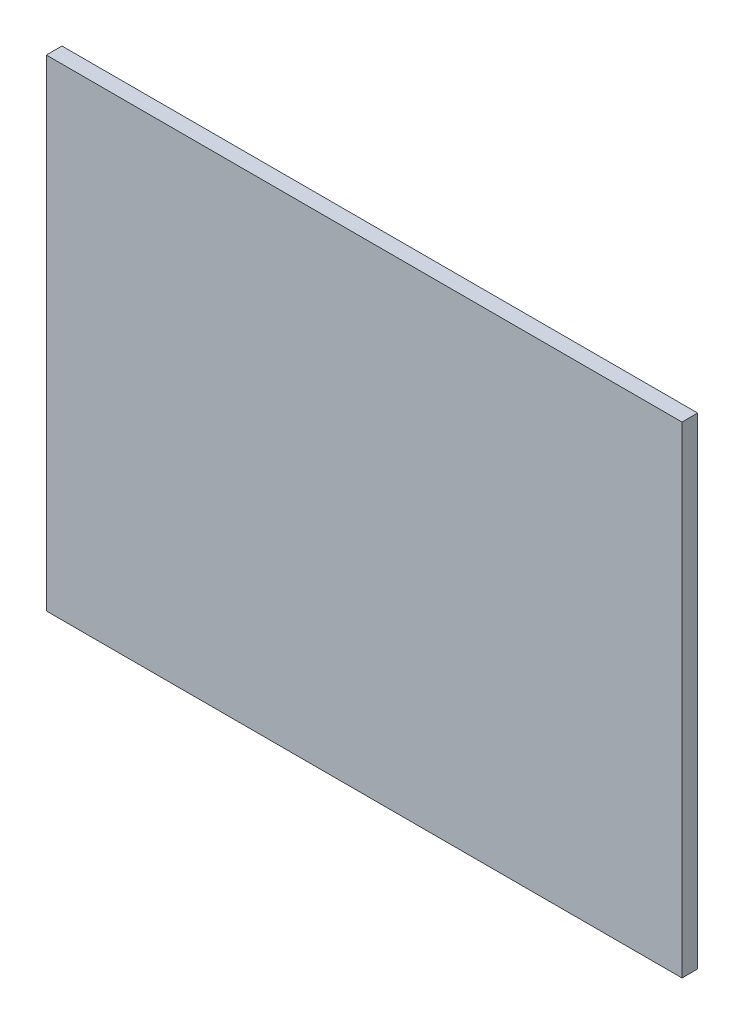
ISO-10303-21;
HEADER;
FILE_DESCRIPTION(('STEP AP214'),'2;1');
FILE_NAME('part.step','',(''),(''),'','','');
FILE_SCHEMA(('AUTOMOTIVE_DESIGN { 1 0 10303 214 1 1 1 1 }'));
ENDSEC;
DATA;
#1=APPLICATION_CONTEXT('core data for automotive mechanical design processes');
#2=APPLICATION_PROTOCOL_DEFINITION('international standard','automotive_design',2000,#1);
#3=PRODUCT_CONTEXT('',#1,'mechanical');
#4=PRODUCT('Part','Part','',(#3));
#5=PRODUCT_RELATED_PRODUCT_CATEGORY('part','',(#4));
#6=PRODUCT_DEFINITION_FORMATION('','',#4);
#7=PRODUCT_DEFINITION_CONTEXT('part definition',#1,'design');
#8=PRODUCT_DEFINITION('design','',#6,#7);
#9=PRODUCT_DEFINITION_SHAPE('','',#8);
#10=(LENGTH_UNIT() NAMED_UNIT(*) SI_UNIT(.MILLI.,.METRE.));
#11=(NAMED_UNIT(*) PLANE_ANGLE_UNIT() SI_UNIT($,.RADIAN.));
#12=(NAMED_UNIT(*) SI_UNIT($,.STERADIAN.) SOLID_ANGLE_UNIT());
#13=UNCERTAINTY_MEASURE_WITH_UNIT(LENGTH_MEASURE(1.E-05),#10,'distance_accuracy_value','');
#14=(GEOMETRIC_REPRESENTATION_CONTEXT(3) GLOBAL_UNCERTAINTY_ASSIGNED_CONTEXT((#13)) GLOBAL_UNIT_ASSIGNED_CONTEXT((#10,
#11,#12)) REPRESENTATION_CONTEXT('',''));
#15=CARTESIAN_POINT('',(0.,0.,0.));
#16=DIRECTION('',(0.,0.,1.));
#17=DIRECTION('',(1.,0.,0.));
#18=AXIS2_PLACEMENT_3D('',#15,#16,#17);
#19=CARTESIAN_POINT('',(206.368778379794,-412.72012546708,-10.16));
#20=DIRECTION('',(1.,0.,0.));
#21=DIRECTION('',(0.,0.,-1.));
#22=AXIS2_PLACEMENT_3D('',#19,#20,#21);
#23=PLANE('',#22);
#24=DIRECTION('',(0.,1.,0.));
#25=VECTOR('',#24,1.);
#26=CARTESIAN_POINT('',(206.368778379794,-412.72012546708,0.));
#27=LINE('',#26,#25);
#28=CARTESIAN_POINT('',(206.368778379794,-412.72012546708,0.));
#29=VERTEX_POINT('',#28);
#30=CARTESIAN_POINT('',(206.368778379794,-100.02012546708,0.));
#31=VERTEX_POINT('',#30);
#32=EDGE_CURVE('E101',#29,#31,#27,.T.);
#33=ORIENTED_EDGE('',*,*,#32,.F.);
#34=DIRECTION('',(0.,0.,1.));
#35=VECTOR('',#34,1.);
#36=CARTESIAN_POINT('',(206.368778379794,-412.72012546708,-10.16));
#37=LINE('',#36,#35);
#38=CARTESIAN_POINT('',(206.368778379794,-412.72012546708,-10.16));
#39=VERTEX_POINT('',#38);
#40=EDGE_CURVE('E11',#39,#29,#37,.T.);
#41=ORIENTED_EDGE('',*,*,#40,.F.);
#42=DIRECTION('',(0.,1.,0.));
#43=VECTOR('',#42,1.);
#44=CARTESIAN_POINT('',(206.368778379794,-412.72012546708,-10.16));
#45=LINE('',#44,#43);
#46=CARTESIAN_POINT('',(206.368778379794,-100.02012546708,-10.16));
#47=VERTEX_POINT('',#46);
#48=EDGE_CURVE('E95',#39,#47,#45,.T.);
#49=ORIENTED_EDGE('',*,*,#48,.T.);
#50=DIRECTION('',(0.,0.,1.));
#51=VECTOR('',#50,1.);
#52=CARTESIAN_POINT('',(206.368778379794,-100.02012546708,-10.16));
#53=LINE('',#52,#51);
#54=EDGE_CURVE('E40',#47,#31,#53,.T.);
#55=ORIENTED_EDGE('',*,*,#54,.T.);
#56=EDGE_LOOP('',(#33,#41,#49,#55));
#57=FACE_BOUND('',#56,.T.);
#58=ADVANCED_FACE('F37',(#57),#23,.T.);
#59=CARTESIAN_POINT('',(206.368778379794,-412.72012546708,-10.16));
#60=DIRECTION('',(0.,-1.,0.));
#61=DIRECTION('',(1.,0.,0.));
#62=AXIS2_PLACEMENT_3D('',#59,#60,#61);
#63=PLANE('',#62);
#64=DIRECTION('',(1.,0.,0.));
#65=VECTOR('',#64,1.);
#66=CARTESIAN_POINT('',(206.368778379794,-412.72012546708,0.));
#67=LINE('',#66,#65);
#68=CARTESIAN_POINT('',(-206.499999999998,-412.72012546708,0.));
#69=VERTEX_POINT('',#68);
#70=EDGE_CURVE('E97',#69,#29,#67,.T.);
#71=ORIENTED_EDGE('',*,*,#70,.F.);
#72=DIRECTION('',(0.,0.,1.));
#73=VECTOR('',#72,1.);
#74=CARTESIAN_POINT('',(-206.499999999998,-412.72012546708,-10.16));
#75=LINE('',#74,#73);
#76=CARTESIAN_POINT('',(-206.499999999998,-412.72012546708,-10.16));
#77=VERTEX_POINT('',#76);
#78=EDGE_CURVE('E46',#77,#69,#75,.T.);
#79=ORIENTED_EDGE('',*,*,#78,.F.);
#80=DIRECTION('',(1.,0.,0.));
#81=VECTOR('',#80,1.);
#82=CARTESIAN_POINT('',(206.368778379794,-412.72012546708,-10.16));
#83=LINE('',#82,#81);
#84=EDGE_CURVE('E92',#77,#39,#83,.T.);
#85=ORIENTED_EDGE('',*,*,#84,.T.);
#86=ORIENTED_EDGE('',*,*,#40,.T.);
#87=EDGE_LOOP('',(#71,#79,#85,#86));
#88=FACE_BOUND('',#87,.T.);
#89=ADVANCED_FACE('F111',(#88),#63,.T.);
#90=CARTESIAN_POINT('',(-206.499999999998,-412.72012546708,-10.16));
#91=DIRECTION('',(-1.,0.,0.));
#92=DIRECTION('',(0.,0.,1.));
#93=AXIS2_PLACEMENT_3D('',#90,#91,#92);
#94=PLANE('',#93);
#95=DIRECTION('',(0.,-1.,0.));
#96=VECTOR('',#95,1.);
#97=CARTESIAN_POINT('',(-206.499999999998,-412.72012546708,0.));
#98=LINE('',#97,#96);
#99=CARTESIAN_POINT('',(-206.499999999998,-100.02012546708,0.));
#100=VERTEX_POINT('',#99);
#101=EDGE_CURVE('E87',#100,#69,#98,.T.);
#102=ORIENTED_EDGE('',*,*,#101,.F.);
#103=DIRECTION('',(0.,0.,1.));
#104=VECTOR('',#103,1.);
#105=CARTESIAN_POINT('',(-206.499999999998,-100.02012546708,-10.16));
#106=LINE('',#105,#104);
#107=CARTESIAN_POINT('',(-206.499999999998,-100.02012546708,-10.16));
#108=VERTEX_POINT('',#107);
#109=EDGE_CURVE('E82',#108,#100,#106,.T.);
#110=ORIENTED_EDGE('',*,*,#109,.F.);
#111=DIRECTION('',(0.,-1.,0.));
#112=VECTOR('',#111,1.);
#113=CARTESIAN_POINT('',(-206.499999999998,-412.72012546708,-10.16));
#114=LINE('',#113,#112);
#115=EDGE_CURVE('E85',#108,#77,#114,.T.);
#116=ORIENTED_EDGE('',*,*,#115,.T.);
#117=ORIENTED_EDGE('',*,*,#78,.T.);
#118=EDGE_LOOP('',(#102,#110,#116,#117));
#119=FACE_BOUND('',#118,.T.);
#120=ADVANCED_FACE('F84',(#119),#94,.T.);
#121=CARTESIAN_POINT('',(206.368778379794,-100.02012546708,-10.16));
#122=DIRECTION('',(0.,1.,0.));
#123=DIRECTION('',(-1.,0.,0.));
#124=AXIS2_PLACEMENT_3D('',#121,#122,#123);
#125=PLANE('',#124);
#126=DIRECTION('',(-1.,0.,0.));
#127=VECTOR('',#126,1.);
#128=CARTESIAN_POINT('',(206.368778379794,-100.02012546708,0.));
#129=LINE('',#128,#127);
#130=EDGE_CURVE('E104',#31,#100,#129,.T.);
#131=ORIENTED_EDGE('',*,*,#130,.F.);
#132=ORIENTED_EDGE('',*,*,#54,.F.);
#133=DIRECTION('',(-1.,0.,0.));
#134=VECTOR('',#133,1.);
#135=CARTESIAN_POINT('',(206.368778379794,-100.02012546708,-10.16));
#136=LINE('',#135,#134);
#137=EDGE_CURVE('E91',#47,#108,#136,.T.);
#138=ORIENTED_EDGE('',*,*,#137,.T.);
#139=ORIENTED_EDGE('',*,*,#109,.T.);
#140=EDGE_LOOP('',(#131,#132,#138,#139));
#141=FACE_BOUND('',#140,.T.);
#142=ADVANCED_FACE('F94',(#141),#125,.T.);
#143=CARTESIAN_POINT('',(0.,0.,-10.16));
#144=DIRECTION('',(0.,0.,1.));
#145=DIRECTION('',(1.,0.,0.));
#146=AXIS2_PLACEMENT_3D('',#143,#144,#145);
#147=PLANE('',#146);
#148=ORIENTED_EDGE('',*,*,#48,.F.);
#149=ORIENTED_EDGE('',*,*,#84,.F.);
#150=ORIENTED_EDGE('',*,*,#115,.F.);
#151=ORIENTED_EDGE('',*,*,#137,.F.);
#152=EDGE_LOOP('',(#148,#149,#150,#151));
#153=FACE_BOUND('',#152,.T.);
#154=ADVANCED_FACE('F90',(#153),#147,.F.);
#155=CARTESIAN_POINT('',(0.,0.,0.));
#156=DIRECTION('',(0.,0.,1.));
#157=DIRECTION('',(1.,0.,0.));
#158=AXIS2_PLACEMENT_3D('',#155,#156,#157);
#159=PLANE('',#158);
#160=ORIENTED_EDGE('',*,*,#32,.T.);
#161=ORIENTED_EDGE('',*,*,#130,.T.);
#162=ORIENTED_EDGE('',*,*,#101,.T.);
#163=ORIENTED_EDGE('',*,*,#70,.T.);
#164=EDGE_LOOP('',(#160,#161,#162,#163));
#165=FACE_BOUND('',#164,.T.);
#166=ADVANCED_FACE('F110',(#165),#159,.T.);
#167=CLOSED_SHELL('',(#58,#89,#120,#142,#154,#166));
#168=MANIFOLD_SOLID_BREP('B2',#167);
#169=ADVANCED_BREP_SHAPE_REPRESENTATION('',(#18,#168),#14);
#170=SHAPE_DEFINITION_REPRESENTATION(#9,#169);
ENDSEC;
END-ISO-10303-21;
